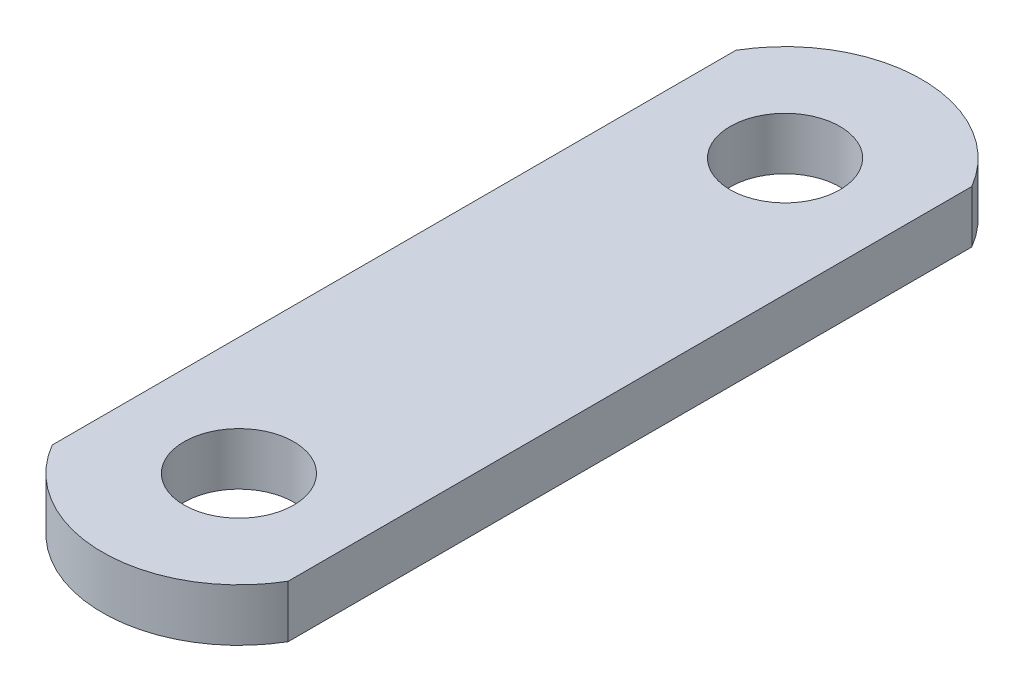
ISO-10303-21;
HEADER;
FILE_DESCRIPTION(('STEP AP214'),'2;1');
FILE_NAME('part.step','',(''),(''),'','','');
FILE_SCHEMA(('AUTOMOTIVE_DESIGN { 1 0 10303 214 1 1 1 1 }'));
ENDSEC;
DATA;
#1=APPLICATION_CONTEXT('core data for automotive mechanical design processes');
#2=APPLICATION_PROTOCOL_DEFINITION('international standard','automotive_design',2000,#1);
#3=PRODUCT_CONTEXT('',#1,'mechanical');
#4=PRODUCT('Part','Part','',(#3));
#5=PRODUCT_RELATED_PRODUCT_CATEGORY('part','',(#4));
#6=PRODUCT_DEFINITION_FORMATION('','',#4);
#7=PRODUCT_DEFINITION_CONTEXT('part definition',#1,'design');
#8=PRODUCT_DEFINITION('design','',#6,#7);
#9=PRODUCT_DEFINITION_SHAPE('','',#8);
#10=(LENGTH_UNIT() NAMED_UNIT(*) SI_UNIT(.MILLI.,.METRE.));
#11=(NAMED_UNIT(*) PLANE_ANGLE_UNIT() SI_UNIT($,.RADIAN.));
#12=(NAMED_UNIT(*) SI_UNIT($,.STERADIAN.) SOLID_ANGLE_UNIT());
#13=UNCERTAINTY_MEASURE_WITH_UNIT(LENGTH_MEASURE(1.E-05),#10,'distance_accuracy_value','');
#14=(GEOMETRIC_REPRESENTATION_CONTEXT(3) GLOBAL_UNCERTAINTY_ASSIGNED_CONTEXT((#13)) GLOBAL_UNIT_ASSIGNED_CONTEXT((#10,
#11,#12)) REPRESENTATION_CONTEXT('',''));
#15=CARTESIAN_POINT('',(0.,0.,0.));
#16=DIRECTION('',(0.,0.,1.));
#17=DIRECTION('',(1.,0.,0.));
#18=AXIS2_PLACEMENT_3D('',#15,#16,#17);
#19=CARTESIAN_POINT('',(0.,0.,38.1));
#20=DIRECTION('',(1.,0.,0.));
#21=DIRECTION('',(0.,0.,-1.));
#22=AXIS2_PLACEMENT_3D('',#19,#20,#21);
#23=PLANE('',#22);
#24=DIRECTION('',(0.,0.,-1.));
#25=VECTOR('',#24,1.);
#26=CARTESIAN_POINT('',(0.,0.,38.1));
#27=LINE('',#26,#25);
#28=CARTESIAN_POINT('',(0.,0.,34.9471729762401));
#29=VERTEX_POINT('',#28);
#30=CARTESIAN_POINT('',(0.,0.,3.15282702375989));
#31=VERTEX_POINT('',#30);
#32=EDGE_CURVE('E11',#29,#31,#27,.T.);
#33=ORIENTED_EDGE('',*,*,#32,.F.);
#34=DIRECTION('',(0.,1.,0.));
#35=VECTOR('',#34,1.);
#36=CARTESIAN_POINT('',(0.,0.,34.9471729762401));
#37=LINE('',#36,#35);
#38=CARTESIAN_POINT('',(0.,2.4384,34.9471729762401));
#39=VERTEX_POINT('',#38);
#40=EDGE_CURVE('E82',#29,#39,#37,.T.);
#41=ORIENTED_EDGE('',*,*,#40,.T.);
#42=DIRECTION('',(0.,0.,-1.));
#43=VECTOR('',#42,1.);
#44=CARTESIAN_POINT('',(0.,2.4384,38.1));
#45=LINE('',#44,#43);
#46=CARTESIAN_POINT('',(0.,2.4384,3.15282702375989));
#47=VERTEX_POINT('',#46);
#48=EDGE_CURVE('E55',#39,#47,#45,.T.);
#49=ORIENTED_EDGE('',*,*,#48,.T.);
#50=DIRECTION('',(0.,1.,0.));
#51=VECTOR('',#50,1.);
#52=CARTESIAN_POINT('',(0.,0.,3.15282702375989));
#53=LINE('',#52,#51);
#54=EDGE_CURVE('E86',#31,#47,#53,.T.);
#55=ORIENTED_EDGE('',*,*,#54,.F.);
#56=EDGE_LOOP('',(#33,#41,#49,#55));
#57=FACE_BOUND('',#56,.T.);
#58=ADVANCED_FACE('F35',(#57),#23,.F.);
#59=CARTESIAN_POINT('',(0.,0.,38.1));
#60=DIRECTION('',(0.,1.,0.));
#61=DIRECTION('',(0.,0.,1.));
#62=AXIS2_PLACEMENT_3D('',#59,#60,#61);
#63=PLANE('',#62);
#64=CARTESIAN_POINT('',(5.4864,0.,6.35));
#65=DIRECTION('',(0.,1.,0.));
#66=DIRECTION('',(0.,0.,1.));
#67=AXIS2_PLACEMENT_3D('',#64,#65,#66);
#68=CIRCLE('',#67,2.5527);
#69=CARTESIAN_POINT('',(5.4864,0.,8.9027));
#70=VERTEX_POINT('',#69);
#71=EDGE_CURVE('E94',#70,#70,#68,.T.);
#72=ORIENTED_EDGE('',*,*,#71,.T.);
#73=EDGE_LOOP('',(#72));
#74=FACE_BOUND('',#73,.T.);
#75=CARTESIAN_POINT('',(5.4864,0.,31.75));
#76=DIRECTION('',(0.,1.,0.));
#77=DIRECTION('',(0.,0.,1.));
#78=AXIS2_PLACEMENT_3D('',#75,#76,#77);
#79=CIRCLE('',#78,2.5527);
#80=CARTESIAN_POINT('',(5.4864,0.,34.3027));
#81=VERTEX_POINT('',#80);
#82=EDGE_CURVE('E105',#81,#81,#79,.T.);
#83=ORIENTED_EDGE('',*,*,#82,.T.);
#84=EDGE_LOOP('',(#83));
#85=FACE_BOUND('',#84,.T.);
#86=CARTESIAN_POINT('',(5.4864,0.,31.75));
#87=DIRECTION('',(0.,-1.,0.));
#88=DIRECTION('',(0.,0.,-1.));
#89=AXIS2_PLACEMENT_3D('',#86,#87,#88);
#90=CIRCLE('',#89,6.35);
#91=CARTESIAN_POINT('',(10.9728,0.,34.9471729762401));
#92=VERTEX_POINT('',#91);
#93=EDGE_CURVE('E74',#92,#29,#90,.T.);
#94=ORIENTED_EDGE('',*,*,#93,.T.);
#95=ORIENTED_EDGE('',*,*,#32,.T.);
#96=CARTESIAN_POINT('',(5.4864,0.,6.35));
#97=DIRECTION('',(0.,-1.,0.));
#98=DIRECTION('',(0.,0.,-1.));
#99=AXIS2_PLACEMENT_3D('',#96,#97,#98);
#100=CIRCLE('',#99,6.35);
#101=CARTESIAN_POINT('',(10.9728,0.,3.15282702375989));
#102=VERTEX_POINT('',#101);
#103=EDGE_CURVE('E91',#31,#102,#100,.T.);
#104=ORIENTED_EDGE('',*,*,#103,.T.);
#105=DIRECTION('',(0.,0.,-1.));
#106=VECTOR('',#105,1.);
#107=CARTESIAN_POINT('',(10.9728,0.,38.1));
#108=LINE('',#107,#106);
#109=EDGE_CURVE('E42',#92,#102,#108,.T.);
#110=ORIENTED_EDGE('',*,*,#109,.F.);
#111=EDGE_LOOP('',(#94,#95,#104,#110));
#112=FACE_BOUND('',#111,.T.);
#113=ADVANCED_FACE('F76',(#74,#85,#112),#63,.F.);
#114=CARTESIAN_POINT('',(10.9728,0.,38.1));
#115=DIRECTION('',(-1.,0.,0.));
#116=DIRECTION('',(0.,0.,1.));
#117=AXIS2_PLACEMENT_3D('',#114,#115,#116);
#118=PLANE('',#117);
#119=DIRECTION('',(0.,0.,-1.));
#120=VECTOR('',#119,1.);
#121=CARTESIAN_POINT('',(10.9728,2.4384,38.1));
#122=LINE('',#121,#120);
#123=CARTESIAN_POINT('',(10.9728,2.4384,34.9471729762401));
#124=VERTEX_POINT('',#123);
#125=CARTESIAN_POINT('',(10.9728,2.4384,3.15282702375989));
#126=VERTEX_POINT('',#125);
#127=EDGE_CURVE('E109',#124,#126,#122,.T.);
#128=ORIENTED_EDGE('',*,*,#127,.F.);
#129=DIRECTION('',(0.,1.,0.));
#130=VECTOR('',#129,1.);
#131=CARTESIAN_POINT('',(10.9728,0.,34.9471729762401));
#132=LINE('',#131,#130);
#133=EDGE_CURVE('E79',#124,#92,#132,.F.);
#134=ORIENTED_EDGE('',*,*,#133,.T.);
#135=ORIENTED_EDGE('',*,*,#109,.T.);
#136=DIRECTION('',(0.,1.,0.));
#137=VECTOR('',#136,1.);
#138=CARTESIAN_POINT('',(10.9728,0.,3.15282702375989));
#139=LINE('',#138,#137);
#140=EDGE_CURVE('E115',#102,#126,#139,.T.);
#141=ORIENTED_EDGE('',*,*,#140,.T.);
#142=EDGE_LOOP('',(#128,#134,#135,#141));
#143=FACE_BOUND('',#142,.T.);
#144=ADVANCED_FACE('F113',(#143),#118,.F.);
#145=CARTESIAN_POINT('',(0.,2.4384,38.1));
#146=DIRECTION('',(0.,-1.,0.));
#147=DIRECTION('',(0.,0.,-1.));
#148=AXIS2_PLACEMENT_3D('',#145,#146,#147);
#149=PLANE('',#148);
#150=CARTESIAN_POINT('',(5.4864,2.4384,6.35));
#151=DIRECTION('',(0.,1.,0.));
#152=DIRECTION('',(0.,0.,1.));
#153=AXIS2_PLACEMENT_3D('',#150,#151,#152);
#154=CIRCLE('',#153,2.55269999999999);
#155=CARTESIAN_POINT('',(5.4864,2.4384,8.90269999999999));
#156=VERTEX_POINT('',#155);
#157=EDGE_CURVE('E90',#156,#156,#154,.T.);
#158=ORIENTED_EDGE('',*,*,#157,.F.);
#159=EDGE_LOOP('',(#158));
#160=FACE_BOUND('',#159,.T.);
#161=CARTESIAN_POINT('',(5.4864,2.4384,31.75));
#162=DIRECTION('',(0.,1.,0.));
#163=DIRECTION('',(0.,0.,1.));
#164=AXIS2_PLACEMENT_3D('',#161,#162,#163);
#165=CIRCLE('',#164,2.55269999999999);
#166=CARTESIAN_POINT('',(5.4864,2.4384,34.3027));
#167=VERTEX_POINT('',#166);
#168=EDGE_CURVE('E102',#167,#167,#165,.T.);
#169=ORIENTED_EDGE('',*,*,#168,.F.);
#170=EDGE_LOOP('',(#169));
#171=FACE_BOUND('',#170,.T.);
#172=ORIENTED_EDGE('',*,*,#48,.F.);
#173=CARTESIAN_POINT('',(5.4864,2.4384,31.75));
#174=DIRECTION('',(0.,-1.,0.));
#175=DIRECTION('',(0.,0.,-1.));
#176=AXIS2_PLACEMENT_3D('',#173,#174,#175);
#177=CIRCLE('',#176,6.35);
#178=EDGE_CURVE('E80',#124,#39,#177,.T.);
#179=ORIENTED_EDGE('',*,*,#178,.F.);
#180=ORIENTED_EDGE('',*,*,#127,.T.);
#181=CARTESIAN_POINT('',(5.4864,2.4384,6.35));
#182=DIRECTION('',(0.,-1.,0.));
#183=DIRECTION('',(0.,0.,-1.));
#184=AXIS2_PLACEMENT_3D('',#181,#182,#183);
#185=CIRCLE('',#184,6.35);
#186=EDGE_CURVE('E96',#47,#126,#185,.T.);
#187=ORIENTED_EDGE('',*,*,#186,.F.);
#188=EDGE_LOOP('',(#172,#179,#180,#187));
#189=FACE_BOUND('',#188,.T.);
#190=ADVANCED_FACE('F121',(#160,#171,#189),#149,.F.);
#191=CARTESIAN_POINT('',(5.4864,2.4384,31.75));
#192=DIRECTION('',(0.,1.,0.));
#193=DIRECTION('',(0.,0.,1.));
#194=AXIS2_PLACEMENT_3D('',#191,#192,#193);
#195=CYLINDRICAL_SURFACE('',#194,2.55269999999999);
#196=ORIENTED_EDGE('',*,*,#82,.F.);
#197=EDGE_LOOP('',(#196));
#198=FACE_BOUND('',#197,.T.);
#199=ORIENTED_EDGE('',*,*,#168,.T.);
#200=EDGE_LOOP('',(#199));
#201=FACE_BOUND('',#200,.T.);
#202=ADVANCED_FACE('F123',(#198,#201),#195,.F.);
#203=CARTESIAN_POINT('',(5.4864,2.4384,6.35));
#204=DIRECTION('',(0.,1.,0.));
#205=DIRECTION('',(0.,0.,1.));
#206=AXIS2_PLACEMENT_3D('',#203,#204,#205);
#207=CYLINDRICAL_SURFACE('',#206,2.55269999999999);
#208=ORIENTED_EDGE('',*,*,#71,.F.);
#209=EDGE_LOOP('',(#208));
#210=FACE_BOUND('',#209,.T.);
#211=ORIENTED_EDGE('',*,*,#157,.T.);
#212=EDGE_LOOP('',(#211));
#213=FACE_BOUND('',#212,.T.);
#214=ADVANCED_FACE('F130',(#210,#213),#207,.F.);
#215=CARTESIAN_POINT('',(5.4864,0.,6.35));
#216=DIRECTION('',(0.,1.,0.));
#217=DIRECTION('',(0.,0.,1.));
#218=AXIS2_PLACEMENT_3D('',#215,#216,#217);
#219=CYLINDRICAL_SURFACE('',#218,6.35);
#220=ORIENTED_EDGE('',*,*,#186,.T.);
#221=ORIENTED_EDGE('',*,*,#140,.F.);
#222=ORIENTED_EDGE('',*,*,#103,.F.);
#223=ORIENTED_EDGE('',*,*,#54,.T.);
#224=EDGE_LOOP('',(#220,#221,#222,#223));
#225=FACE_BOUND('',#224,.T.);
#226=ADVANCED_FACE('F116',(#225),#219,.T.);
#227=CARTESIAN_POINT('',(5.4864,0.,31.75));
#228=DIRECTION('',(0.,1.,0.));
#229=DIRECTION('',(0.,0.,1.));
#230=AXIS2_PLACEMENT_3D('',#227,#228,#229);
#231=CYLINDRICAL_SURFACE('',#230,6.35);
#232=ORIENTED_EDGE('',*,*,#178,.T.);
#233=ORIENTED_EDGE('',*,*,#40,.F.);
#234=ORIENTED_EDGE('',*,*,#93,.F.);
#235=ORIENTED_EDGE('',*,*,#133,.F.);
#236=EDGE_LOOP('',(#232,#233,#234,#235));
#237=FACE_BOUND('',#236,.T.);
#238=ADVANCED_FACE('F83',(#237),#231,.T.);
#239=CLOSED_SHELL('',(#58,#113,#144,#190,#202,#214,#226,#238));
#240=MANIFOLD_SOLID_BREP('B2',#239);
#241=ADVANCED_BREP_SHAPE_REPRESENTATION('',(#18,#240),#14);
#242=SHAPE_DEFINITION_REPRESENTATION(#9,#241);
ENDSEC;
END-ISO-10303-21;
